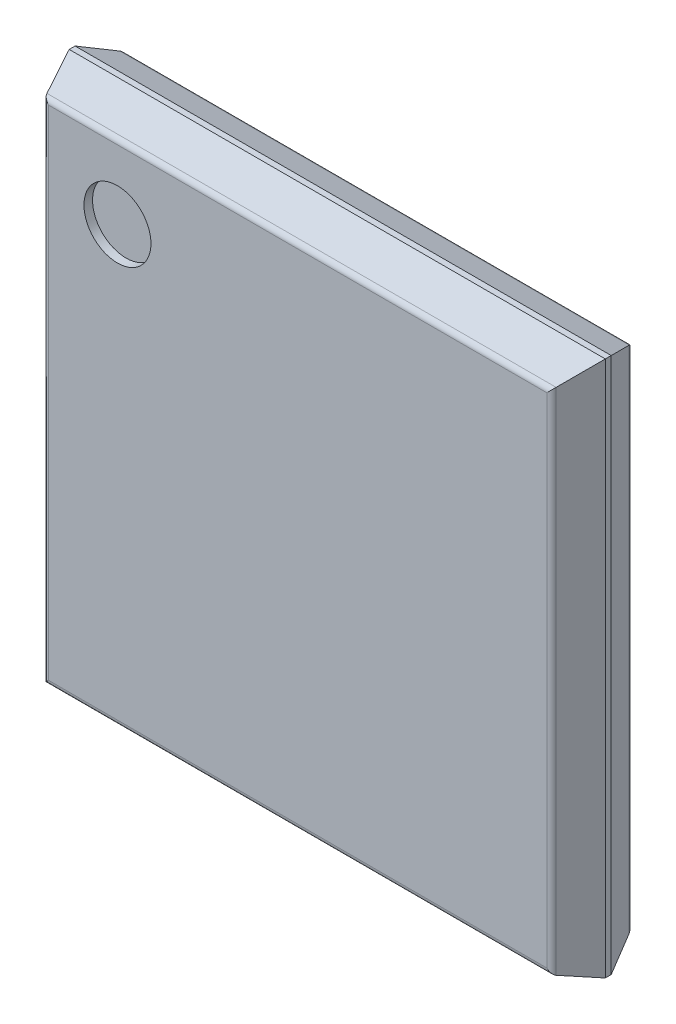
ISO-10303-21;
HEADER;
FILE_DESCRIPTION(('STEP AP214'),'2;1');
FILE_NAME('part.step','',(''),(''),'','','');
FILE_SCHEMA(('AUTOMOTIVE_DESIGN { 1 0 10303 214 1 1 1 1 }'));
ENDSEC;
DATA;
#1=APPLICATION_CONTEXT('core data for automotive mechanical design processes');
#2=APPLICATION_PROTOCOL_DEFINITION('international standard','automotive_design',2000,#1);
#3=PRODUCT_CONTEXT('',#1,'mechanical');
#4=PRODUCT('Part','Part','',(#3));
#5=PRODUCT_RELATED_PRODUCT_CATEGORY('part','',(#4));
#6=PRODUCT_DEFINITION_FORMATION('','',#4);
#7=PRODUCT_DEFINITION_CONTEXT('part definition',#1,'design');
#8=PRODUCT_DEFINITION('design','',#6,#7);
#9=PRODUCT_DEFINITION_SHAPE('','',#8);
#10=(LENGTH_UNIT() NAMED_UNIT(*) SI_UNIT(.MILLI.,.METRE.));
#11=(NAMED_UNIT(*) PLANE_ANGLE_UNIT() SI_UNIT($,.RADIAN.));
#12=(NAMED_UNIT(*) SI_UNIT($,.STERADIAN.) SOLID_ANGLE_UNIT());
#13=UNCERTAINTY_MEASURE_WITH_UNIT(LENGTH_MEASURE(1.E-05),#10,'distance_accuracy_value','');
#14=(GEOMETRIC_REPRESENTATION_CONTEXT(3) GLOBAL_UNCERTAINTY_ASSIGNED_CONTEXT((#13)) GLOBAL_UNIT_ASSIGNED_CONTEXT((#10,
#11,#12)) REPRESENTATION_CONTEXT('',''));
#15=CARTESIAN_POINT('',(0.,0.,0.));
#16=DIRECTION('',(0.,0.,1.));
#17=DIRECTION('',(1.,0.,0.));
#18=AXIS2_PLACEMENT_3D('',#15,#16,#17);
#19=CARTESIAN_POINT('',(-3.362,3.362,1.44));
#20=DIRECTION('',(0.,0.,1.));
#21=DIRECTION('',(1.,0.,0.));
#22=AXIS2_PLACEMENT_3D('',#19,#20,#21);
#23=PLANE('',#22);
#24=CARTESIAN_POINT('',(-3.362,3.362,1.44));
#25=DIRECTION('',(0.,0.,1.));
#26=DIRECTION('',(1.,0.,0.));
#27=AXIS2_PLACEMENT_3D('',#24,#25,#26);
#28=CIRCLE('',#27,0.625);
#29=CARTESIAN_POINT('',(-2.737,3.362,1.44));
#30=VERTEX_POINT('',#29);
#31=EDGE_CURVE('E20',#30,#30,#28,.T.);
#32=ORIENTED_EDGE('',*,*,#31,.T.);
#33=EDGE_LOOP('',(#32));
#34=FACE_BOUND('',#33,.T.);
#35=ADVANCED_FACE('F17',(#34),#23,.T.);
#36=CARTESIAN_POINT('',(-3.362,3.362,1.44));
#37=DIRECTION('',(0.,0.,1.));
#38=DIRECTION('',(1.,0.,0.));
#39=AXIS2_PLACEMENT_3D('',#36,#37,#38);
#40=CYLINDRICAL_SURFACE('',#39,0.625);
#41=CARTESIAN_POINT('',(-3.362,3.362,1.6));
#42=DIRECTION('',(0.,0.,1.));
#43=DIRECTION('',(1.,0.,0.));
#44=AXIS2_PLACEMENT_3D('',#41,#42,#43);
#45=CIRCLE('',#44,0.625);
#46=CARTESIAN_POINT('',(-2.737,3.362,1.6));
#47=VERTEX_POINT('',#46);
#48=EDGE_CURVE('E100',#47,#47,#45,.F.);
#49=ORIENTED_EDGE('',*,*,#48,.F.);
#50=EDGE_LOOP('',(#49));
#51=FACE_BOUND('',#50,.T.);
#52=ORIENTED_EDGE('',*,*,#31,.F.);
#53=EDGE_LOOP('',(#52));
#54=FACE_BOUND('',#53,.T.);
#55=ADVANCED_FACE('F117',(#51,#54),#40,.F.);
#56=CARTESIAN_POINT('',(-5.,-5.,1.6));
#57=DIRECTION('',(0.,0.,1.));
#58=DIRECTION('',(1.,0.,0.));
#59=AXIS2_PLACEMENT_3D('',#56,#57,#58);
#60=PLANE('',#59);
#61=ORIENTED_EDGE('',*,*,#48,.T.);
#62=EDGE_LOOP('',(#61));
#63=FACE_BOUND('',#62,.T.);
#64=DIRECTION('',(0.,1.,0.));
#65=VECTOR('',#64,1.);
#66=CARTESIAN_POINT('',(4.645902284743,-4.722,1.6));
#67=LINE('',#66,#65);
#68=CARTESIAN_POINT('',(4.645902284743,4.645902284743,1.6));
#69=VERTEX_POINT('',#68);
#70=CARTESIAN_POINT('',(4.645902284743,-4.645902284743,1.6));
#71=VERTEX_POINT('',#70);
#72=EDGE_CURVE('E107',#69,#71,#67,.F.);
#73=ORIENTED_EDGE('',*,*,#72,.F.);
#74=DIRECTION('',(1.,0.,0.));
#75=VECTOR('',#74,1.);
#76=CARTESIAN_POINT('',(-4.722,4.645902284743,1.6));
#77=LINE('',#76,#75);
#78=CARTESIAN_POINT('',(-4.645902284743,4.645902284743,1.6));
#79=VERTEX_POINT('',#78);
#80=EDGE_CURVE('E96',#79,#69,#77,.T.);
#81=ORIENTED_EDGE('',*,*,#80,.F.);
#82=DIRECTION('',(0.,1.,0.));
#83=VECTOR('',#82,1.);
#84=CARTESIAN_POINT('',(-4.645902284743,-4.722,1.6));
#85=LINE('',#84,#83);
#86=CARTESIAN_POINT('',(-4.645902284743,-4.645902284743,1.6));
#87=VERTEX_POINT('',#86);
#88=EDGE_CURVE('E92',#87,#79,#85,.T.);
#89=ORIENTED_EDGE('',*,*,#88,.F.);
#90=DIRECTION('',(1.,0.,0.));
#91=VECTOR('',#90,1.);
#92=CARTESIAN_POINT('',(-4.722,-4.645902284743,1.6));
#93=LINE('',#92,#91);
#94=EDGE_CURVE('E81',#71,#87,#93,.F.);
#95=ORIENTED_EDGE('',*,*,#94,.F.);
#96=EDGE_LOOP('',(#73,#81,#89,#95));
#97=FACE_BOUND('',#96,.T.);
#98=ADVANCED_FACE('F95',(#63,#97),#60,.T.);
#99=CARTESIAN_POINT('',(-4.645902284743,-4.722,1.49));
#100=DIRECTION('',(0.,1.,0.));
#101=DIRECTION('',(0.,0.,1.));
#102=AXIS2_PLACEMENT_3D('',#99,#100,#101);
#103=CYLINDRICAL_SURFACE('',#102,0.11);
#104=CARTESIAN_POINT('',(-4.645902284743,4.645902284743,1.49));
#105=DIRECTION('',(0.707106781186547,0.707106781186547,0.));
#106=DIRECTION('',(0.707106781186547,-0.707106781186547,0.));
#107=AXIS2_PLACEMENT_3D('',#104,#105,#106);
#108=ELLIPSE('',#107,0.15556349186104,0.11);
#109=CARTESIAN_POINT('',(-4.74883554093284,4.74883554093282,1.52879103981818));
#110=VERTEX_POINT('',#109);
#111=EDGE_CURVE('E414',#110,#79,#108,.T.);
#112=ORIENTED_EDGE('',*,*,#111,.F.);
#113=DIRECTION('',(0.,1.,0.));
#114=VECTOR('',#113,1.);
#115=CARTESIAN_POINT('',(-4.74883554093296,-5.,1.52879103981799));
#116=LINE('',#115,#114);
#117=CARTESIAN_POINT('',(-4.74883554093284,-4.74883554093282,1.52879103981818));
#118=VERTEX_POINT('',#117);
#119=EDGE_CURVE('E104',#110,#118,#116,.F.);
#120=ORIENTED_EDGE('',*,*,#119,.T.);
#121=CARTESIAN_POINT('',(-4.645902284743,-4.645902284743,1.49));
#122=DIRECTION('',(0.707106781186547,-0.707106781186547,0.));
#123=DIRECTION('',(0.707106781186547,0.707106781186547,0.));
#124=AXIS2_PLACEMENT_3D('',#121,#122,#123);
#125=ELLIPSE('',#124,0.15556349186104,0.11);
#126=EDGE_CURVE('E86',#87,#118,#125,.T.);
#127=ORIENTED_EDGE('',*,*,#126,.F.);
#128=ORIENTED_EDGE('',*,*,#88,.T.);
#129=EDGE_LOOP('',(#112,#120,#127,#128));
#130=FACE_BOUND('',#129,.T.);
#131=ADVANCED_FACE('F103',(#130),#103,.T.);
#132=CARTESIAN_POINT('',(-4.722,-4.645902284743,1.49));
#133=DIRECTION('',(1.,0.,0.));
#134=DIRECTION('',(0.,0.,-1.));
#135=AXIS2_PLACEMENT_3D('',#132,#133,#134);
#136=CYLINDRICAL_SURFACE('',#135,0.11);
#137=ORIENTED_EDGE('',*,*,#94,.T.);
#138=ORIENTED_EDGE('',*,*,#126,.T.);
#139=DIRECTION('',(1.,0.,0.));
#140=VECTOR('',#139,1.);
#141=CARTESIAN_POINT('',(-5.,-4.74883554093296,1.52879103981799));
#142=LINE('',#141,#140);
#143=CARTESIAN_POINT('',(4.74883554093282,-4.74883554093284,1.52879103981818));
#144=VERTEX_POINT('',#143);
#145=EDGE_CURVE('E431',#118,#144,#142,.T.);
#146=ORIENTED_EDGE('',*,*,#145,.T.);
#147=CARTESIAN_POINT('',(4.645902284743,-4.645902284743,1.49));
#148=DIRECTION('',(0.707106781186547,0.707106781186547,0.));
#149=DIRECTION('',(-0.707106781186547,0.707106781186547,0.));
#150=AXIS2_PLACEMENT_3D('',#147,#148,#149);
#151=ELLIPSE('',#150,0.15556349186104,0.11);
#152=EDGE_CURVE('E88',#71,#144,#151,.T.);
#153=ORIENTED_EDGE('',*,*,#152,.F.);
#154=EDGE_LOOP('',(#137,#138,#146,#153));
#155=FACE_BOUND('',#154,.T.);
#156=ADVANCED_FACE('F83',(#155),#136,.T.);
#157=CARTESIAN_POINT('',(4.645902284743,-4.722,1.49));
#158=DIRECTION('',(0.,1.,0.));
#159=DIRECTION('',(0.,0.,1.));
#160=AXIS2_PLACEMENT_3D('',#157,#158,#159);
#161=CYLINDRICAL_SURFACE('',#160,0.11);
#162=CARTESIAN_POINT('',(4.645902284743,4.645902284743,1.49));
#163=DIRECTION('',(0.707106781186547,-0.707106781186547,0.));
#164=DIRECTION('',(0.707106781186547,0.707106781186547,0.));
#165=AXIS2_PLACEMENT_3D('',#162,#163,#164);
#166=ELLIPSE('',#165,0.15556349186104,0.11);
#167=CARTESIAN_POINT('',(4.74883554093284,4.74883554093282,1.52879103981819));
#168=VERTEX_POINT('',#167);
#169=EDGE_CURVE('E408',#69,#168,#166,.F.);
#170=ORIENTED_EDGE('',*,*,#169,.F.);
#171=ORIENTED_EDGE('',*,*,#72,.T.);
#172=ORIENTED_EDGE('',*,*,#152,.T.);
#173=DIRECTION('',(0.,1.,0.));
#174=VECTOR('',#173,1.);
#175=CARTESIAN_POINT('',(4.74883554093296,-5.,1.52879103981799));
#176=LINE('',#175,#174);
#177=EDGE_CURVE('E410',#168,#144,#176,.F.);
#178=ORIENTED_EDGE('',*,*,#177,.F.);
#179=EDGE_LOOP('',(#170,#171,#172,#178));
#180=FACE_BOUND('',#179,.T.);
#181=ADVANCED_FACE('F200',(#180),#161,.T.);
#182=CARTESIAN_POINT('',(-4.722,4.645902284743,1.49));
#183=DIRECTION('',(1.,0.,0.));
#184=DIRECTION('',(0.,0.,-1.));
#185=AXIS2_PLACEMENT_3D('',#182,#183,#184);
#186=CYLINDRICAL_SURFACE('',#185,0.11);
#187=DIRECTION('',(1.,0.,0.));
#188=VECTOR('',#187,1.);
#189=CARTESIAN_POINT('',(-5.,4.74883554093296,1.52879103981799));
#190=LINE('',#189,#188);
#191=EDGE_CURVE('E436',#110,#168,#190,.T.);
#192=ORIENTED_EDGE('',*,*,#191,.F.);
#193=ORIENTED_EDGE('',*,*,#111,.T.);
#194=ORIENTED_EDGE('',*,*,#80,.T.);
#195=ORIENTED_EDGE('',*,*,#169,.T.);
#196=EDGE_LOOP('',(#192,#193,#194,#195));
#197=FACE_BOUND('',#196,.T.);
#198=ADVANCED_FACE('F196',(#197),#186,.T.);
#199=CARTESIAN_POINT('',(-4.861,-5.,1.231159085259));
#200=DIRECTION('',(0.935756874451536,0.,-0.352645816530825));
#201=DIRECTION('',(-0.352645816530825,0.,-0.935756874451536));
#202=AXIS2_PLACEMENT_3D('',#199,#200,#201);
#203=PLANE('',#202);
#204=DIRECTION('',(0.332572413353444,-0.332572413353561,0.882491461574816));
#205=VECTOR('',#204,1.);
#206=CARTESIAN_POINT('',(-5.,5.00000000000005,0.862318170518019));
#207=LINE('',#206,#205);
#208=CARTESIAN_POINT('',(-5.,5.00000000000001,0.862318170518005));
#209=VERTEX_POINT('',#208);
#210=EDGE_CURVE('E459',#209,#110,#207,.T.);
#211=ORIENTED_EDGE('',*,*,#210,.F.);
#212=DIRECTION('',(0.,1.,0.));
#213=VECTOR('',#212,1.);
#214=CARTESIAN_POINT('',(-5.,-5.,0.862318170518));
#215=LINE('',#214,#213);
#216=CARTESIAN_POINT('',(-5.,-5.00000000000001,0.862318170518005));
#217=VERTEX_POINT('',#216);
#218=EDGE_CURVE('E477',#209,#217,#215,.F.);
#219=ORIENTED_EDGE('',*,*,#218,.T.);
#220=DIRECTION('',(0.332572413353444,0.332572413353561,0.882491461574816));
#221=VECTOR('',#220,1.);
#222=CARTESIAN_POINT('',(-5.,-5.00000000000005,0.862318170518019));
#223=LINE('',#222,#221);
#224=EDGE_CURVE('E433',#217,#118,#223,.T.);
#225=ORIENTED_EDGE('',*,*,#224,.T.);
#226=ORIENTED_EDGE('',*,*,#119,.F.);
#227=EDGE_LOOP('',(#211,#219,#225,#226));
#228=FACE_BOUND('',#227,.T.);
#229=ADVANCED_FACE('F192',(#228),#203,.F.);
#230=CARTESIAN_POINT('',(-5.,-4.861,1.231159085259));
#231=DIRECTION('',(0.,0.935756874451536,-0.352645816530825));
#232=DIRECTION('',(0.,0.352645816530825,0.935756874451536));
#233=AXIS2_PLACEMENT_3D('',#230,#231,#232);
#234=PLANE('',#233);
#235=DIRECTION('',(1.,0.,0.));
#236=VECTOR('',#235,1.);
#237=CARTESIAN_POINT('',(-5.,-5.,0.862318170518));
#238=LINE('',#237,#236);
#239=CARTESIAN_POINT('',(5.00000000000001,-5.,0.862318170518005));
#240=VERTEX_POINT('',#239);
#241=EDGE_CURVE('E446',#217,#240,#238,.T.);
#242=ORIENTED_EDGE('',*,*,#241,.T.);
#243=DIRECTION('',(0.332572413353561,-0.332572413353444,-0.882491461574816));
#244=VECTOR('',#243,1.);
#245=CARTESIAN_POINT('',(4.74883554093296,-4.748835540933,1.52879103981799));
#246=LINE('',#245,#244);
#247=EDGE_CURVE('E437',#144,#240,#246,.T.);
#248=ORIENTED_EDGE('',*,*,#247,.F.);
#249=ORIENTED_EDGE('',*,*,#145,.F.);
#250=ORIENTED_EDGE('',*,*,#224,.F.);
#251=EDGE_LOOP('',(#242,#248,#249,#250));
#252=FACE_BOUND('',#251,.T.);
#253=ADVANCED_FACE('F188',(#252),#234,.F.);
#254=CARTESIAN_POINT('',(4.861,-5.,1.231159085259));
#255=DIRECTION('',(0.935756874451536,0.,0.352645816530825));
#256=DIRECTION('',(0.352645816530825,0.,-0.935756874451536));
#257=AXIS2_PLACEMENT_3D('',#254,#255,#256);
#258=PLANE('',#257);
#259=DIRECTION('',(0.332572413353444,0.332572413353561,-0.882491461574816));
#260=VECTOR('',#259,1.);
#261=CARTESIAN_POINT('',(4.748835540933,4.74883554093296,1.52879103981799));
#262=LINE('',#261,#260);
#263=CARTESIAN_POINT('',(5.,5.00000000000001,0.862318170518005));
#264=VERTEX_POINT('',#263);
#265=EDGE_CURVE('E439',#168,#264,#262,.T.);
#266=ORIENTED_EDGE('',*,*,#265,.F.);
#267=ORIENTED_EDGE('',*,*,#177,.T.);
#268=ORIENTED_EDGE('',*,*,#247,.T.);
#269=DIRECTION('',(0.,1.,0.));
#270=VECTOR('',#269,1.);
#271=CARTESIAN_POINT('',(5.,-5.,0.862318170518));
#272=LINE('',#271,#270);
#273=EDGE_CURVE('E462',#264,#240,#272,.F.);
#274=ORIENTED_EDGE('',*,*,#273,.F.);
#275=EDGE_LOOP('',(#266,#267,#268,#274));
#276=FACE_BOUND('',#275,.T.);
#277=ADVANCED_FACE('F184',(#276),#258,.T.);
#278=CARTESIAN_POINT('',(-5.,4.861,1.231159085259));
#279=DIRECTION('',(0.,0.935756874451536,0.352645816530825));
#280=DIRECTION('',(0.,-0.352645816530825,0.935756874451536));
#281=AXIS2_PLACEMENT_3D('',#278,#279,#280);
#282=PLANE('',#281);
#283=DIRECTION('',(1.,0.,0.));
#284=VECTOR('',#283,1.);
#285=CARTESIAN_POINT('',(-5.,5.,0.862318170518));
#286=LINE('',#285,#284);
#287=EDGE_CURVE('E468',#209,#264,#286,.T.);
#288=ORIENTED_EDGE('',*,*,#287,.F.);
#289=ORIENTED_EDGE('',*,*,#210,.T.);
#290=ORIENTED_EDGE('',*,*,#191,.T.);
#291=ORIENTED_EDGE('',*,*,#265,.T.);
#292=EDGE_LOOP('',(#288,#289,#290,#291));
#293=FACE_BOUND('',#292,.T.);
#294=ADVANCED_FACE('F180',(#293),#282,.T.);
#295=CARTESIAN_POINT('',(-5.,-5.,0.1));
#296=DIRECTION('',(1.,0.,0.));
#297=DIRECTION('',(0.,0.,-1.));
#298=AXIS2_PLACEMENT_3D('',#295,#296,#297);
#299=PLANE('',#298);
#300=DIRECTION('',(0.,0.,1.));
#301=VECTOR('',#300,1.);
#302=CARTESIAN_POINT('',(-5.,5.,0.1));
#303=LINE('',#302,#301);
#304=CARTESIAN_POINT('',(-5.00000000000004,5.00000000000013,0.752318170517947));
#305=VERTEX_POINT('',#304);
#306=EDGE_CURVE('E472',#305,#209,#303,.T.);
#307=ORIENTED_EDGE('',*,*,#306,.F.);
#308=DIRECTION('',(0.,1.,0.));
#309=VECTOR('',#308,1.);
#310=CARTESIAN_POINT('',(-5.00000000000017,-5.,0.75231817051793));
#311=LINE('',#310,#309);
#312=CARTESIAN_POINT('',(-5.00000000000004,-5.00000000000008,0.752318170517947));
#313=VERTEX_POINT('',#312);
#314=EDGE_CURVE('E471',#313,#305,#311,.T.);
#315=ORIENTED_EDGE('',*,*,#314,.F.);
#316=DIRECTION('',(0.,0.,1.));
#317=VECTOR('',#316,1.);
#318=CARTESIAN_POINT('',(-5.,-5.,0.1));
#319=LINE('',#318,#317);
#320=EDGE_CURVE('E450',#313,#217,#319,.T.);
#321=ORIENTED_EDGE('',*,*,#320,.T.);
#322=ORIENTED_EDGE('',*,*,#218,.F.);
#323=EDGE_LOOP('',(#307,#315,#321,#322));
#324=FACE_BOUND('',#323,.T.);
#325=ADVANCED_FACE('F176',(#324),#299,.F.);
#326=CARTESIAN_POINT('',(-5.,-5.,0.1));
#327=DIRECTION('',(0.,1.,0.));
#328=DIRECTION('',(0.,0.,1.));
#329=AXIS2_PLACEMENT_3D('',#326,#327,#328);
#330=PLANE('',#329);
#331=ORIENTED_EDGE('',*,*,#320,.F.);
#332=DIRECTION('',(1.,0.,0.));
#333=VECTOR('',#332,1.);
#334=CARTESIAN_POINT('',(-5.,-5.00000000000017,0.75231817051793));
#335=LINE('',#334,#333);
#336=CARTESIAN_POINT('',(5.00000000000009,-5.00000000000004,0.752318170517929));
#337=VERTEX_POINT('',#336);
#338=EDGE_CURVE('E488',#337,#313,#335,.F.);
#339=ORIENTED_EDGE('',*,*,#338,.F.);
#340=DIRECTION('',(0.,0.,-1.));
#341=VECTOR('',#340,1.);
#342=CARTESIAN_POINT('',(5.,-5.,0.1));
#343=LINE('',#342,#341);
#344=EDGE_CURVE('E449',#240,#337,#343,.T.);
#345=ORIENTED_EDGE('',*,*,#344,.F.);
#346=ORIENTED_EDGE('',*,*,#241,.F.);
#347=EDGE_LOOP('',(#331,#339,#345,#346));
#348=FACE_BOUND('',#347,.T.);
#349=ADVANCED_FACE('F172',(#348),#330,.F.);
#350=CARTESIAN_POINT('',(5.,-5.,0.1));
#351=DIRECTION('',(1.,0.,0.));
#352=DIRECTION('',(0.,0.,-1.));
#353=AXIS2_PLACEMENT_3D('',#350,#351,#352);
#354=PLANE('',#353);
#355=DIRECTION('',(0.,0.,1.));
#356=VECTOR('',#355,1.);
#357=CARTESIAN_POINT('',(5.,5.,0.1));
#358=LINE('',#357,#356);
#359=CARTESIAN_POINT('',(5.00000000000004,5.00000000000008,0.75231817051793));
#360=VERTEX_POINT('',#359);
#361=EDGE_CURVE('E465',#264,#360,#358,.F.);
#362=ORIENTED_EDGE('',*,*,#361,.F.);
#363=ORIENTED_EDGE('',*,*,#273,.T.);
#364=ORIENTED_EDGE('',*,*,#344,.T.);
#365=DIRECTION('',(0.,1.,0.));
#366=VECTOR('',#365,1.);
#367=CARTESIAN_POINT('',(5.00000000000017,-5.,0.75231817051793));
#368=LINE('',#367,#366);
#369=EDGE_CURVE('E498',#337,#360,#368,.T.);
#370=ORIENTED_EDGE('',*,*,#369,.T.);
#371=EDGE_LOOP('',(#362,#363,#364,#370));
#372=FACE_BOUND('',#371,.T.);
#373=ADVANCED_FACE('F168',(#372),#354,.T.);
#374=CARTESIAN_POINT('',(-5.,5.,0.1));
#375=DIRECTION('',(0.,1.,0.));
#376=DIRECTION('',(0.,0.,1.));
#377=AXIS2_PLACEMENT_3D('',#374,#375,#376);
#378=PLANE('',#377);
#379=ORIENTED_EDGE('',*,*,#306,.T.);
#380=ORIENTED_EDGE('',*,*,#287,.T.);
#381=ORIENTED_EDGE('',*,*,#361,.T.);
#382=DIRECTION('',(1.,0.,0.));
#383=VECTOR('',#382,1.);
#384=CARTESIAN_POINT('',(-5.,5.00000000000017,0.75231817051793));
#385=LINE('',#384,#383);
#386=EDGE_CURVE('E513',#360,#305,#385,.F.);
#387=ORIENTED_EDGE('',*,*,#386,.T.);
#388=EDGE_LOOP('',(#379,#380,#381,#387));
#389=FACE_BOUND('',#388,.T.);
#390=ADVANCED_FACE('F164',(#389),#378,.T.);
#391=CARTESIAN_POINT('',(-4.861,-5.,0.426159085259));
#392=DIRECTION('',(-0.919942213562356,0.,-0.392053980602152));
#393=DIRECTION('',(-0.392053980602152,0.,0.919942213562356));
#394=AXIS2_PLACEMENT_3D('',#391,#392,#393);
#395=PLANE('',#394);
#396=DIRECTION('',(0.365004510426787,-0.365004510426813,-0.856471490906839));
#397=VECTOR('',#396,1.);
#398=CARTESIAN_POINT('',(-5.,5.00000000000017,0.75231817051793));
#399=LINE('',#398,#397);
#400=CARTESIAN_POINT('',(-4.75049987952693,4.75049987952701,0.166874062133883));
#401=VERTEX_POINT('',#400);
#402=EDGE_CURVE('E516',#305,#401,#399,.T.);
#403=ORIENTED_EDGE('',*,*,#402,.T.);
#404=DIRECTION('',(0.,1.,0.));
#405=VECTOR('',#404,1.);
#406=CARTESIAN_POINT('',(-4.75049987952697,-4.722,0.166874062134015));
#407=LINE('',#406,#405);
#408=CARTESIAN_POINT('',(-4.75049987952693,-4.75049987952702,0.166874062133884));
#409=VERTEX_POINT('',#408);
#410=EDGE_CURVE('E421',#409,#401,#407,.T.);
#411=ORIENTED_EDGE('',*,*,#410,.F.);
#412=DIRECTION('',(0.365004510426787,0.365004510426813,-0.856471490906839));
#413=VECTOR('',#412,1.);
#414=CARTESIAN_POINT('',(-5.,-5.00000000000017,0.75231817051793));
#415=LINE('',#414,#413);
#416=EDGE_CURVE('E491',#313,#409,#415,.T.);
#417=ORIENTED_EDGE('',*,*,#416,.F.);
#418=ORIENTED_EDGE('',*,*,#314,.T.);
#419=EDGE_LOOP('',(#403,#411,#417,#418));
#420=FACE_BOUND('',#419,.T.);
#421=ADVANCED_FACE('F160',(#420),#395,.T.);
#422=CARTESIAN_POINT('',(-5.,-4.861,0.426159085259));
#423=DIRECTION('',(0.,-0.919942213562356,-0.392053980602152));
#424=DIRECTION('',(0.,0.392053980602152,-0.919942213562356));
#425=AXIS2_PLACEMENT_3D('',#422,#423,#424);
#426=PLANE('',#425);
#427=ORIENTED_EDGE('',*,*,#338,.T.);
#428=ORIENTED_EDGE('',*,*,#416,.T.);
#429=DIRECTION('',(1.,0.,0.));
#430=VECTOR('',#429,1.);
#431=CARTESIAN_POINT('',(-4.722,-4.75049987952697,0.166874062134015));
#432=LINE('',#431,#430);
#433=CARTESIAN_POINT('',(4.75049987952702,-4.75049987952693,0.166874062133884));
#434=VERTEX_POINT('',#433);
#435=EDGE_CURVE('E420',#434,#409,#432,.F.);
#436=ORIENTED_EDGE('',*,*,#435,.F.);
#437=DIRECTION('',(0.365004510426813,-0.365004510426787,0.856471490906839));
#438=VECTOR('',#437,1.);
#439=CARTESIAN_POINT('',(4.75049987952715,-4.750499879527,0.166874062133937));
#440=LINE('',#439,#438);
#441=EDGE_CURVE('E502',#434,#337,#440,.T.);
#442=ORIENTED_EDGE('',*,*,#441,.T.);
#443=EDGE_LOOP('',(#427,#428,#436,#442));
#444=FACE_BOUND('',#443,.T.);
#445=ADVANCED_FACE('F156',(#444),#426,.T.);
#446=CARTESIAN_POINT('',(4.861,-5.,0.426159085259));
#447=DIRECTION('',(-0.919942213562356,0.,0.392053980602152));
#448=DIRECTION('',(0.392053980602152,0.,0.919942213562356));
#449=AXIS2_PLACEMENT_3D('',#446,#447,#448);
#450=PLANE('',#449);
#451=DIRECTION('',(0.365004510426789,0.365004510426813,0.856471490906839));
#452=VECTOR('',#451,1.);
#453=CARTESIAN_POINT('',(4.750499879527,4.75049987952715,0.166874062133937));
#454=LINE('',#453,#452);
#455=CARTESIAN_POINT('',(4.75049987952693,4.75049987952702,0.166874062133883));
#456=VERTEX_POINT('',#455);
#457=EDGE_CURVE('E501',#456,#360,#454,.T.);
#458=ORIENTED_EDGE('',*,*,#457,.T.);
#459=ORIENTED_EDGE('',*,*,#369,.F.);
#460=ORIENTED_EDGE('',*,*,#441,.F.);
#461=DIRECTION('',(0.,1.,0.));
#462=VECTOR('',#461,1.);
#463=CARTESIAN_POINT('',(4.75049987952697,-4.722,0.166874062134015));
#464=LINE('',#463,#462);
#465=EDGE_CURVE('E425',#456,#434,#464,.F.);
#466=ORIENTED_EDGE('',*,*,#465,.F.);
#467=EDGE_LOOP('',(#458,#459,#460,#466));
#468=FACE_BOUND('',#467,.T.);
#469=ADVANCED_FACE('F152',(#468),#450,.F.);
#470=CARTESIAN_POINT('',(-5.,4.861,0.426159085259));
#471=DIRECTION('',(0.,-0.919942213562356,0.392053980602152));
#472=DIRECTION('',(0.,-0.392053980602152,-0.919942213562356));
#473=AXIS2_PLACEMENT_3D('',#470,#471,#472);
#474=PLANE('',#473);
#475=ORIENTED_EDGE('',*,*,#386,.F.);
#476=ORIENTED_EDGE('',*,*,#457,.F.);
#477=DIRECTION('',(1.,0.,0.));
#478=VECTOR('',#477,1.);
#479=CARTESIAN_POINT('',(-4.722,4.75049987952697,0.166874062134015));
#480=LINE('',#479,#478);
#481=EDGE_CURVE('E428',#401,#456,#480,.T.);
#482=ORIENTED_EDGE('',*,*,#481,.F.);
#483=ORIENTED_EDGE('',*,*,#402,.F.);
#484=EDGE_LOOP('',(#475,#476,#482,#483));
#485=FACE_BOUND('',#484,.T.);
#486=ADVANCED_FACE('F148',(#485),#474,.F.);
#487=CARTESIAN_POINT('',(-4.649306236035,-4.722,0.21));
#488=DIRECTION('',(0.,1.,0.));
#489=DIRECTION('',(0.,0.,1.));
#490=AXIS2_PLACEMENT_3D('',#487,#488,#489);
#491=CYLINDRICAL_SURFACE('',#490,0.11);
#492=DIRECTION('',(0.,1.,0.));
#493=VECTOR('',#492,1.);
#494=CARTESIAN_POINT('',(-4.649306236035,-5.,0.1));
#495=LINE('',#494,#493);
#496=CARTESIAN_POINT('',(-4.649306236035,4.649306236035,0.1));
#497=VERTEX_POINT('',#496);
#498=CARTESIAN_POINT('',(-4.649306236035,-4.649306236035,0.1));
#499=VERTEX_POINT('',#498);
#500=EDGE_CURVE('E429',#497,#499,#495,.F.);
#501=ORIENTED_EDGE('',*,*,#500,.T.);
#502=CARTESIAN_POINT('',(-4.649306236035,-4.649306236035,0.21));
#503=DIRECTION('',(0.707106781186547,-0.707106781186547,0.));
#504=DIRECTION('',(0.707106781186547,0.707106781186547,0.));
#505=AXIS2_PLACEMENT_3D('',#502,#503,#504);
#506=ELLIPSE('',#505,0.15556349186104,0.11);
#507=EDGE_CURVE('E418',#409,#499,#506,.T.);
#508=ORIENTED_EDGE('',*,*,#507,.F.);
#509=ORIENTED_EDGE('',*,*,#410,.T.);
#510=CARTESIAN_POINT('',(-4.649306236035,4.649306236035,0.21));
#511=DIRECTION('',(0.707106781186547,0.707106781186547,0.));
#512=DIRECTION('',(0.707106781186547,-0.707106781186547,0.));
#513=AXIS2_PLACEMENT_3D('',#510,#511,#512);
#514=ELLIPSE('',#513,0.15556349186104,0.11);
#515=EDGE_CURVE('E424',#497,#401,#514,.T.);
#516=ORIENTED_EDGE('',*,*,#515,.F.);
#517=EDGE_LOOP('',(#501,#508,#509,#516));
#518=FACE_BOUND('',#517,.T.);
#519=ADVANCED_FACE('F144',(#518),#491,.T.);
#520=CARTESIAN_POINT('',(-4.722,-4.649306236035,0.21));
#521=DIRECTION('',(1.,0.,0.));
#522=DIRECTION('',(0.,0.,-1.));
#523=AXIS2_PLACEMENT_3D('',#520,#521,#522);
#524=CYLINDRICAL_SURFACE('',#523,0.11);
#525=CARTESIAN_POINT('',(4.649306236035,-4.649306236035,0.21));
#526=DIRECTION('',(0.707106781186547,0.707106781186547,0.));
#527=DIRECTION('',(-0.707106781186547,0.707106781186547,0.));
#528=AXIS2_PLACEMENT_3D('',#525,#526,#527);
#529=ELLIPSE('',#528,0.15556349186104,0.11);
#530=CARTESIAN_POINT('',(4.649306236035,-4.649306236035,0.1));
#531=VERTEX_POINT('',#530);
#532=EDGE_CURVE('E422',#434,#531,#529,.T.);
#533=ORIENTED_EDGE('',*,*,#532,.F.);
#534=ORIENTED_EDGE('',*,*,#435,.T.);
#535=ORIENTED_EDGE('',*,*,#507,.T.);
#536=DIRECTION('',(1.,0.,0.));
#537=VECTOR('',#536,1.);
#538=CARTESIAN_POINT('',(-5.,-4.649306236035,0.1));
#539=LINE('',#538,#537);
#540=EDGE_CURVE('E539',#499,#531,#539,.T.);
#541=ORIENTED_EDGE('',*,*,#540,.T.);
#542=EDGE_LOOP('',(#533,#534,#535,#541));
#543=FACE_BOUND('',#542,.T.);
#544=ADVANCED_FACE('F140',(#543),#524,.T.);
#545=CARTESIAN_POINT('',(4.649306236035,-4.722,0.21));
#546=DIRECTION('',(0.,1.,0.));
#547=DIRECTION('',(0.,0.,1.));
#548=AXIS2_PLACEMENT_3D('',#545,#546,#547);
#549=CYLINDRICAL_SURFACE('',#548,0.11);
#550=ORIENTED_EDGE('',*,*,#465,.T.);
#551=ORIENTED_EDGE('',*,*,#532,.T.);
#552=DIRECTION('',(0.,1.,0.));
#553=VECTOR('',#552,1.);
#554=CARTESIAN_POINT('',(4.649306236035,-5.,0.1));
#555=LINE('',#554,#553);
#556=CARTESIAN_POINT('',(4.649306236035,4.649306236035,0.1));
#557=VERTEX_POINT('',#556);
#558=EDGE_CURVE('E26',#531,#557,#555,.T.);
#559=ORIENTED_EDGE('',*,*,#558,.T.);
#560=CARTESIAN_POINT('',(4.649306236035,4.649306236035,0.21));
#561=DIRECTION('',(0.707106781186547,-0.707106781186547,0.));
#562=DIRECTION('',(0.707106781186547,0.707106781186547,0.));
#563=AXIS2_PLACEMENT_3D('',#560,#561,#562);
#564=ELLIPSE('',#563,0.15556349186104,0.11);
#565=EDGE_CURVE('E34',#456,#557,#564,.F.);
#566=ORIENTED_EDGE('',*,*,#565,.F.);
#567=EDGE_LOOP('',(#550,#551,#559,#566));
#568=FACE_BOUND('',#567,.T.);
#569=ADVANCED_FACE('F134',(#568),#549,.T.);
#570=CARTESIAN_POINT('',(-4.722,4.649306236035,0.21));
#571=DIRECTION('',(1.,0.,0.));
#572=DIRECTION('',(0.,0.,-1.));
#573=AXIS2_PLACEMENT_3D('',#570,#571,#572);
#574=CYLINDRICAL_SURFACE('',#573,0.11);
#575=ORIENTED_EDGE('',*,*,#565,.T.);
#576=DIRECTION('',(1.,0.,0.));
#577=VECTOR('',#576,1.);
#578=CARTESIAN_POINT('',(-5.,4.649306236035,0.1));
#579=LINE('',#578,#577);
#580=EDGE_CURVE('E11',#557,#497,#579,.F.);
#581=ORIENTED_EDGE('',*,*,#580,.T.);
#582=ORIENTED_EDGE('',*,*,#515,.T.);
#583=ORIENTED_EDGE('',*,*,#481,.T.);
#584=EDGE_LOOP('',(#575,#581,#582,#583));
#585=FACE_BOUND('',#584,.T.);
#586=ADVANCED_FACE('F128',(#585),#574,.T.);
#587=CARTESIAN_POINT('',(-5.,-5.,0.1));
#588=DIRECTION('',(0.,0.,1.));
#589=DIRECTION('',(1.,0.,0.));
#590=AXIS2_PLACEMENT_3D('',#587,#588,#589);
#591=PLANE('',#590);
#592=ORIENTED_EDGE('',*,*,#558,.F.);
#593=ORIENTED_EDGE('',*,*,#540,.F.);
#594=ORIENTED_EDGE('',*,*,#500,.F.);
#595=ORIENTED_EDGE('',*,*,#580,.F.);
#596=EDGE_LOOP('',(#592,#593,#594,#595));
#597=FACE_BOUND('',#596,.T.);
#598=ADVANCED_FACE('F126',(#597),#591,.F.);
#599=CLOSED_SHELL('',(#35,#55,#98,#131,#156,#181,#198,#229,#253,#277,#294,#325,#349,#373,#390,
#421,#445,#469,#486,#519,#544,#569,#586,#598));
#600=MANIFOLD_SOLID_BREP('B1',#599);
#601=ADVANCED_BREP_SHAPE_REPRESENTATION('',(#18,#600),#14);
#602=SHAPE_DEFINITION_REPRESENTATION(#9,#601);
ENDSEC;
END-ISO-10303-21;
